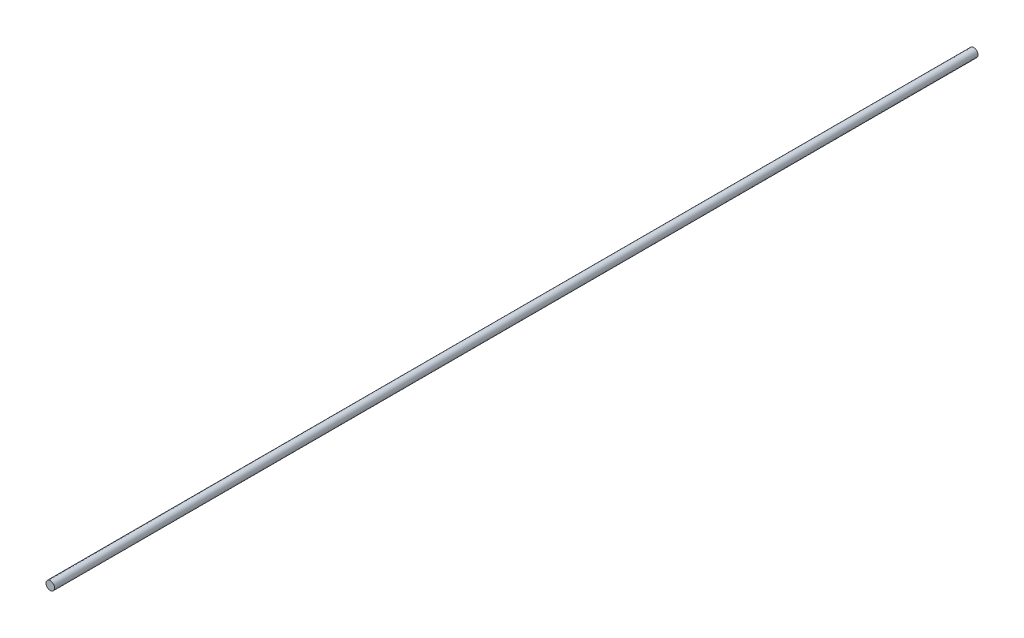
ISO-10303-21;
HEADER;
FILE_DESCRIPTION(('STEP AP214'),'2;1');
FILE_NAME('part.step','',(''),(''),'','','');
FILE_SCHEMA(('AUTOMOTIVE_DESIGN { 1 0 10303 214 1 1 1 1 }'));
ENDSEC;
DATA;
#1=APPLICATION_CONTEXT('core data for automotive mechanical design processes');
#2=APPLICATION_PROTOCOL_DEFINITION('international standard','automotive_design',2000,#1);
#3=PRODUCT_CONTEXT('',#1,'mechanical');
#4=PRODUCT('Part','Part','',(#3));
#5=PRODUCT_RELATED_PRODUCT_CATEGORY('part','',(#4));
#6=PRODUCT_DEFINITION_FORMATION('','',#4);
#7=PRODUCT_DEFINITION_CONTEXT('part definition',#1,'design');
#8=PRODUCT_DEFINITION('design','',#6,#7);
#9=PRODUCT_DEFINITION_SHAPE('','',#8);
#10=(LENGTH_UNIT() NAMED_UNIT(*) SI_UNIT(.MILLI.,.METRE.));
#11=(NAMED_UNIT(*) PLANE_ANGLE_UNIT() SI_UNIT($,.RADIAN.));
#12=(NAMED_UNIT(*) SI_UNIT($,.STERADIAN.) SOLID_ANGLE_UNIT());
#13=UNCERTAINTY_MEASURE_WITH_UNIT(LENGTH_MEASURE(1.E-05),#10,'distance_accuracy_value','');
#14=(GEOMETRIC_REPRESENTATION_CONTEXT(3) GLOBAL_UNCERTAINTY_ASSIGNED_CONTEXT((#13)) GLOBAL_UNIT_ASSIGNED_CONTEXT((#10,
#11,#12)) REPRESENTATION_CONTEXT('',''));
#15=CARTESIAN_POINT('',(0.,0.,0.));
#16=DIRECTION('',(0.,0.,1.));
#17=DIRECTION('',(1.,0.,0.));
#18=AXIS2_PLACEMENT_3D('',#15,#16,#17);
#19=CARTESIAN_POINT('',(0.,0.,685.8));
#20=DIRECTION('',(0.,0.,-1.));
#21=DIRECTION('',(-1.,0.,0.));
#22=AXIS2_PLACEMENT_3D('',#19,#20,#21);
#23=CYLINDRICAL_SURFACE('',#22,3.175);
#24=CARTESIAN_POINT('',(0.,0.,685.8));
#25=DIRECTION('',(0.,0.,1.));
#26=DIRECTION('',(1.,0.,0.));
#27=AXIS2_PLACEMENT_3D('',#24,#25,#26);
#28=CIRCLE('',#27,3.175);
#29=CARTESIAN_POINT('',(3.175,0.,685.8));
#30=VERTEX_POINT('',#29);
#31=EDGE_CURVE('E10',#30,#30,#28,.T.);
#32=ORIENTED_EDGE('',*,*,#31,.F.);
#33=EDGE_LOOP('',(#32));
#34=FACE_BOUND('',#33,.T.);
#35=CARTESIAN_POINT('',(0.,0.,0.));
#36=DIRECTION('',(0.,0.,1.));
#37=DIRECTION('',(1.,0.,0.));
#38=AXIS2_PLACEMENT_3D('',#35,#36,#37);
#39=CIRCLE('',#38,3.175);
#40=CARTESIAN_POINT('',(3.175,0.,0.));
#41=VERTEX_POINT('',#40);
#42=EDGE_CURVE('E35',#41,#41,#39,.T.);
#43=ORIENTED_EDGE('',*,*,#42,.T.);
#44=EDGE_LOOP('',(#43));
#45=FACE_BOUND('',#44,.T.);
#46=ADVANCED_FACE('F32',(#34,#45),#23,.T.);
#47=CARTESIAN_POINT('',(0.,0.,685.8));
#48=DIRECTION('',(0.,0.,1.));
#49=DIRECTION('',(1.,0.,0.));
#50=AXIS2_PLACEMENT_3D('',#47,#48,#49);
#51=PLANE('',#50);
#52=ORIENTED_EDGE('',*,*,#31,.T.);
#53=EDGE_LOOP('',(#52));
#54=FACE_BOUND('',#53,.T.);
#55=ADVANCED_FACE('F47',(#54),#51,.T.);
#56=CARTESIAN_POINT('',(0.,0.,0.));
#57=DIRECTION('',(0.,0.,1.));
#58=DIRECTION('',(1.,0.,0.));
#59=AXIS2_PLACEMENT_3D('',#56,#57,#58);
#60=PLANE('',#59);
#61=ORIENTED_EDGE('',*,*,#42,.F.);
#62=EDGE_LOOP('',(#61));
#63=FACE_BOUND('',#62,.T.);
#64=ADVANCED_FACE('F45',(#63),#60,.F.);
#65=CLOSED_SHELL('',(#46,#55,#64));
#66=MANIFOLD_SOLID_BREP('B2',#65);
#67=ADVANCED_BREP_SHAPE_REPRESENTATION('',(#18,#66),#14);
#68=SHAPE_DEFINITION_REPRESENTATION(#9,#67);
ENDSEC;
END-ISO-10303-21;
